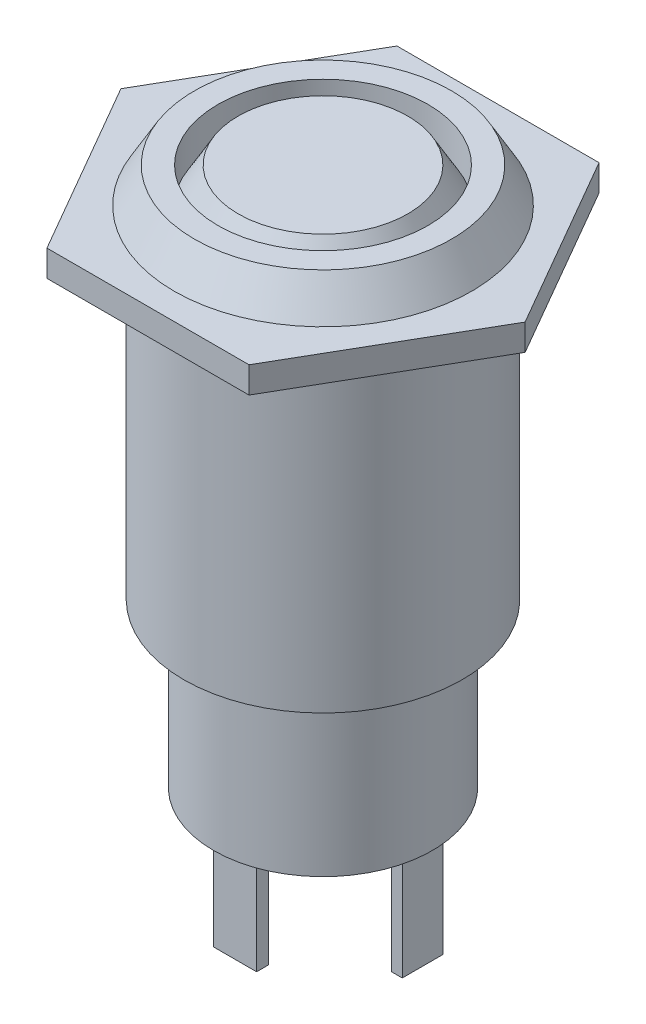
ISO-10303-21;
HEADER;
FILE_DESCRIPTION(('STEP AP214'),'2;1');
FILE_NAME('part.step','',(''),(''),'','','');
FILE_SCHEMA(('AUTOMOTIVE_DESIGN { 1 0 10303 214 1 1 1 1 }'));
ENDSEC;
DATA;
#1=APPLICATION_CONTEXT('core data for automotive mechanical design processes');
#2=APPLICATION_PROTOCOL_DEFINITION('international standard','automotive_design',2000,#1);
#3=PRODUCT_CONTEXT('',#1,'mechanical');
#4=PRODUCT('Part','Part','',(#3));
#5=PRODUCT_RELATED_PRODUCT_CATEGORY('part','',(#4));
#6=PRODUCT_DEFINITION_FORMATION('','',#4);
#7=PRODUCT_DEFINITION_CONTEXT('part definition',#1,'design');
#8=PRODUCT_DEFINITION('design','',#6,#7);
#9=PRODUCT_DEFINITION_SHAPE('','',#8);
#10=(LENGTH_UNIT() NAMED_UNIT(*) SI_UNIT(.MILLI.,.METRE.));
#11=(NAMED_UNIT(*) PLANE_ANGLE_UNIT() SI_UNIT($,.RADIAN.));
#12=(NAMED_UNIT(*) SI_UNIT($,.STERADIAN.) SOLID_ANGLE_UNIT());
#13=UNCERTAINTY_MEASURE_WITH_UNIT(LENGTH_MEASURE(1.E-05),#10,'distance_accuracy_value','');
#14=(GEOMETRIC_REPRESENTATION_CONTEXT(3) GLOBAL_UNCERTAINTY_ASSIGNED_CONTEXT((#13)) GLOBAL_UNIT_ASSIGNED_CONTEXT((#10,
#11,#12)) REPRESENTATION_CONTEXT('',''));
#15=CARTESIAN_POINT('',(0.,0.,0.));
#16=DIRECTION('',(0.,0.,1.));
#17=DIRECTION('',(1.,0.,0.));
#18=AXIS2_PLACEMENT_3D('',#15,#16,#17);
#19=CARTESIAN_POINT('',(0.,-9.3,0.));
#20=DIRECTION('',(0.,-1.,0.));
#21=DIRECTION('',(0.,0.,-1.));
#22=AXIS2_PLACEMENT_3D('',#19,#20,#21);
#23=PLANE('',#22);
#24=CARTESIAN_POINT('',(0.,-9.3,0.));
#25=DIRECTION('',(0.,-1.,0.));
#26=DIRECTION('',(0.,0.,-1.));
#27=AXIS2_PLACEMENT_3D('',#24,#25,#26);
#28=CIRCLE('',#27,6.25);
#29=CARTESIAN_POINT('',(0.,-9.3,-6.25));
#30=VERTEX_POINT('',#29);
#31=EDGE_CURVE('E299',#30,#30,#28,.T.);
#32=ORIENTED_EDGE('',*,*,#31,.T.);
#33=EDGE_LOOP('',(#32));
#34=FACE_BOUND('',#33,.T.);
#35=DIRECTION('',(-1.,0.,0.));
#36=VECTOR('',#35,1.);
#37=CARTESIAN_POINT('',(-1.22799585463233,-9.3,5.02200414536767));
#38=LINE('',#37,#36);
#39=CARTESIAN_POINT('',(1.22799585463233,-9.3,5.02200414536767));
#40=VERTEX_POINT('',#39);
#41=CARTESIAN_POINT('',(-1.22799585463233,-9.3,5.02200414536767));
#42=VERTEX_POINT('',#41);
#43=EDGE_CURVE('E284',#40,#42,#38,.T.);
#44=ORIENTED_EDGE('',*,*,#43,.F.);
#45=DIRECTION('',(0.,0.,1.));
#46=VECTOR('',#45,1.);
#47=CARTESIAN_POINT('',(1.22799585463233,-9.3,4.34589242177077));
#48=LINE('',#47,#46);
#49=CARTESIAN_POINT('',(1.22799585463233,-9.3,4.34589242177077));
#50=VERTEX_POINT('',#49);
#51=EDGE_CURVE('E270',#50,#40,#48,.T.);
#52=ORIENTED_EDGE('',*,*,#51,.F.);
#53=DIRECTION('',(1.,0.,0.));
#54=VECTOR('',#53,1.);
#55=CARTESIAN_POINT('',(-1.22799585463233,-9.3,4.34589242177077));
#56=LINE('',#55,#54);
#57=CARTESIAN_POINT('',(-1.22799585463233,-9.3,4.34589242177077));
#58=VERTEX_POINT('',#57);
#59=EDGE_CURVE('E275',#58,#50,#56,.T.);
#60=ORIENTED_EDGE('',*,*,#59,.F.);
#61=DIRECTION('',(0.,0.,-1.));
#62=VECTOR('',#61,1.);
#63=CARTESIAN_POINT('',(-1.22799585463233,-9.3,4.34589242177077));
#64=LINE('',#63,#62);
#65=EDGE_CURVE('E286',#42,#58,#64,.T.);
#66=ORIENTED_EDGE('',*,*,#65,.F.);
#67=EDGE_LOOP('',(#44,#52,#60,#66));
#68=FACE_BOUND('',#67,.T.);
#69=DIRECTION('',(1.,0.,0.));
#70=VECTOR('',#69,1.);
#71=CARTESIAN_POINT('',(5.69608046213855,-9.3,-1.16693552809612));
#72=LINE('',#71,#70);
#73=CARTESIAN_POINT('',(5.08306447190388,-9.3,-1.16693552809612));
#74=VERTEX_POINT('',#73);
#75=CARTESIAN_POINT('',(5.69608046213855,-9.3,-1.16693552809612));
#76=VERTEX_POINT('',#75);
#77=EDGE_CURVE('E255',#74,#76,#72,.T.);
#78=ORIENTED_EDGE('',*,*,#77,.F.);
#79=DIRECTION('',(0.,0.,-1.));
#80=VECTOR('',#79,1.);
#81=CARTESIAN_POINT('',(5.08306447190388,-9.3,1.16693552809612));
#82=LINE('',#81,#80);
#83=CARTESIAN_POINT('',(5.08306447190388,-9.3,1.16693552809612));
#84=VERTEX_POINT('',#83);
#85=EDGE_CURVE('E241',#84,#74,#82,.T.);
#86=ORIENTED_EDGE('',*,*,#85,.F.);
#87=DIRECTION('',(-1.,0.,0.));
#88=VECTOR('',#87,1.);
#89=CARTESIAN_POINT('',(5.69608046213855,-9.3,1.16693552809612));
#90=LINE('',#89,#88);
#91=CARTESIAN_POINT('',(5.69608046213855,-9.3,1.16693552809612));
#92=VERTEX_POINT('',#91);
#93=EDGE_CURVE('E246',#92,#84,#90,.T.);
#94=ORIENTED_EDGE('',*,*,#93,.F.);
#95=DIRECTION('',(0.,0.,1.));
#96=VECTOR('',#95,1.);
#97=CARTESIAN_POINT('',(5.69608046213855,-9.3,1.16693552809612));
#98=LINE('',#97,#96);
#99=EDGE_CURVE('E257',#76,#92,#98,.T.);
#100=ORIENTED_EDGE('',*,*,#99,.F.);
#101=EDGE_LOOP('',(#78,#86,#94,#100));
#102=FACE_BOUND('',#101,.T.);
#103=DIRECTION('',(-1.,0.,0.));
#104=VECTOR('',#103,1.);
#105=CARTESIAN_POINT('',(-1.22799585463233,-9.3,-4.57555512226407));
#106=LINE('',#105,#104);
#107=CARTESIAN_POINT('',(1.22799585463233,-9.3,-4.57555512226407));
#108=VERTEX_POINT('',#107);
#109=CARTESIAN_POINT('',(-1.22799585463233,-9.3,-4.57555512226407));
#110=VERTEX_POINT('',#109);
#111=EDGE_CURVE('E213',#108,#110,#106,.T.);
#112=ORIENTED_EDGE('',*,*,#111,.F.);
#113=DIRECTION('',(0.,0.,1.));
#114=VECTOR('',#113,1.);
#115=CARTESIAN_POINT('',(1.22799585463233,-9.3,-5.38989741021582));
#116=LINE('',#115,#114);
#117=CARTESIAN_POINT('',(1.22799585463233,-9.3,-5.38989741021582));
#118=VERTEX_POINT('',#117);
#119=EDGE_CURVE('E210',#118,#108,#116,.T.);
#120=ORIENTED_EDGE('',*,*,#119,.F.);
#121=DIRECTION('',(1.,0.,0.));
#122=VECTOR('',#121,1.);
#123=CARTESIAN_POINT('',(-1.22799585463233,-9.3,-5.38989741021582));
#124=LINE('',#123,#122);
#125=CARTESIAN_POINT('',(-1.22799585463233,-9.3,-5.38989741021582));
#126=VERTEX_POINT('',#125);
#127=EDGE_CURVE('E222',#126,#118,#124,.T.);
#128=ORIENTED_EDGE('',*,*,#127,.F.);
#129=DIRECTION('',(0.,0.,-1.));
#130=VECTOR('',#129,1.);
#131=CARTESIAN_POINT('',(-1.22799585463233,-9.3,-5.38989741021582));
#132=LINE('',#131,#130);
#133=EDGE_CURVE('E230',#110,#126,#132,.T.);
#134=ORIENTED_EDGE('',*,*,#133,.F.);
#135=EDGE_LOOP('',(#112,#120,#128,#134));
#136=FACE_BOUND('',#135,.T.);
#137=DIRECTION('',(-1.,0.,0.));
#138=VECTOR('',#137,1.);
#139=CARTESIAN_POINT('',(-5.0090997101677,-9.3,1.16693552809612));
#140=LINE('',#139,#138);
#141=CARTESIAN_POINT('',(-4.40627813467849,-9.3,1.16693552809612));
#142=VERTEX_POINT('',#141);
#143=CARTESIAN_POINT('',(-5.0090997101677,-9.3,1.16693552809612));
#144=VERTEX_POINT('',#143);
#145=EDGE_CURVE('E757',#142,#144,#140,.T.);
#146=ORIENTED_EDGE('',*,*,#145,.F.);
#147=DIRECTION('',(0.,0.,1.));
#148=VECTOR('',#147,1.);
#149=CARTESIAN_POINT('',(-4.40627813467849,-9.3,-1.16693552809612));
#150=LINE('',#149,#148);
#151=CARTESIAN_POINT('',(-4.40627813467849,-9.3,-1.16693552809612));
#152=VERTEX_POINT('',#151);
#153=EDGE_CURVE('E208',#152,#142,#150,.T.);
#154=ORIENTED_EDGE('',*,*,#153,.F.);
#155=DIRECTION('',(1.,0.,0.));
#156=VECTOR('',#155,1.);
#157=CARTESIAN_POINT('',(-5.0090997101677,-9.3,-1.16693552809612));
#158=LINE('',#157,#156);
#159=CARTESIAN_POINT('',(-5.0090997101677,-9.3,-1.16693552809612));
#160=VERTEX_POINT('',#159);
#161=EDGE_CURVE('E204',#160,#152,#158,.T.);
#162=ORIENTED_EDGE('',*,*,#161,.F.);
#163=DIRECTION('',(0.,0.,-1.));
#164=VECTOR('',#163,1.);
#165=CARTESIAN_POINT('',(-5.0090997101677,-9.3,-1.16693552809612));
#166=LINE('',#165,#164);
#167=EDGE_CURVE('E754',#144,#160,#166,.T.);
#168=ORIENTED_EDGE('',*,*,#167,.F.);
#169=EDGE_LOOP('',(#146,#154,#162,#168));
#170=FACE_BOUND('',#169,.T.);
#171=ADVANCED_FACE('F35',(#34,#68,#102,#136,#170),#23,.T.);
#172=CARTESIAN_POINT('',(0.,19.5,0.));
#173=DIRECTION('',(0.,-1.,0.));
#174=DIRECTION('',(0.,0.,-1.));
#175=AXIS2_PLACEMENT_3D('',#172,#173,#174);
#176=CYLINDRICAL_SURFACE('',#175,7.95);
#177=CARTESIAN_POINT('',(0.,0.,0.));
#178=DIRECTION('',(0.,1.,0.));
#179=DIRECTION('',(0.,0.,1.));
#180=AXIS2_PLACEMENT_3D('',#177,#178,#179);
#181=CIRCLE('',#180,7.95);
#182=CARTESIAN_POINT('',(0.,0.,7.95));
#183=VERTEX_POINT('',#182);
#184=EDGE_CURVE('E356',#183,#183,#181,.T.);
#185=ORIENTED_EDGE('',*,*,#184,.T.);
#186=EDGE_LOOP('',(#185));
#187=FACE_BOUND('',#186,.T.);
#188=CARTESIAN_POINT('',(0.,18.,0.));
#189=DIRECTION('',(0.,1.,0.));
#190=DIRECTION('',(0.,0.,1.));
#191=AXIS2_PLACEMENT_3D('',#188,#189,#190);
#192=CIRCLE('',#191,7.95);
#193=CARTESIAN_POINT('',(0.,18.,7.95));
#194=VERTEX_POINT('',#193);
#195=EDGE_CURVE('E43',#194,#194,#192,.T.);
#196=ORIENTED_EDGE('',*,*,#195,.F.);
#197=EDGE_LOOP('',(#196));
#198=FACE_BOUND('',#197,.T.);
#199=ADVANCED_FACE('F37',(#187,#198),#176,.T.);
#200=CARTESIAN_POINT('',(0.,0.,0.));
#201=DIRECTION('',(0.,1.,0.));
#202=DIRECTION('',(0.,0.,1.));
#203=AXIS2_PLACEMENT_3D('',#200,#201,#202);
#204=PLANE('',#203);
#205=CARTESIAN_POINT('',(0.,0.,0.));
#206=DIRECTION('',(0.,1.,0.));
#207=DIRECTION('',(0.,0.,1.));
#208=AXIS2_PLACEMENT_3D('',#205,#206,#207);
#209=CIRCLE('',#208,6.25);
#210=CARTESIAN_POINT('',(0.,0.,6.25));
#211=VERTEX_POINT('',#210);
#212=EDGE_CURVE('E11',#211,#211,#209,.F.);
#213=ORIENTED_EDGE('',*,*,#212,.F.);
#214=EDGE_LOOP('',(#213));
#215=FACE_BOUND('',#214,.T.);
#216=ORIENTED_EDGE('',*,*,#184,.F.);
#217=EDGE_LOOP('',(#216));
#218=FACE_BOUND('',#217,.T.);
#219=ADVANCED_FACE('F374',(#215,#218),#204,.F.);
#220=CARTESIAN_POINT('',(5.77350269189626,18.,10.));
#221=DIRECTION('',(0.866025403784439,0.,0.5));
#222=DIRECTION('',(0.5,0.,-0.866025403784439));
#223=AXIS2_PLACEMENT_3D('',#220,#221,#222);
#224=PLANE('',#223);
#225=DIRECTION('',(0.5,0.,-0.866025403784439));
#226=VECTOR('',#225,1.);
#227=CARTESIAN_POINT('',(5.77350269189626,19.5,10.));
#228=LINE('',#227,#226);
#229=CARTESIAN_POINT('',(5.77350269189626,19.5,10.));
#230=VERTEX_POINT('',#229);
#231=CARTESIAN_POINT('',(11.5470053837925,19.5,0.));
#232=VERTEX_POINT('',#231);
#233=EDGE_CURVE('E317',#230,#232,#228,.T.);
#234=ORIENTED_EDGE('',*,*,#233,.F.);
#235=DIRECTION('',(0.,1.,0.));
#236=VECTOR('',#235,1.);
#237=CARTESIAN_POINT('',(5.77350269189626,18.,10.));
#238=LINE('',#237,#236);
#239=CARTESIAN_POINT('',(5.77350269189626,18.,10.));
#240=VERTEX_POINT('',#239);
#241=EDGE_CURVE('E354',#240,#230,#238,.T.);
#242=ORIENTED_EDGE('',*,*,#241,.F.);
#243=DIRECTION('',(0.5,0.,-0.866025403784439));
#244=VECTOR('',#243,1.);
#245=CARTESIAN_POINT('',(5.77350269189626,18.,10.));
#246=LINE('',#245,#244);
#247=CARTESIAN_POINT('',(11.5470053837925,18.,0.));
#248=VERTEX_POINT('',#247);
#249=EDGE_CURVE('E318',#240,#248,#246,.T.);
#250=ORIENTED_EDGE('',*,*,#249,.T.);
#251=DIRECTION('',(0.,1.,0.));
#252=VECTOR('',#251,1.);
#253=CARTESIAN_POINT('',(11.5470053837925,18.,0.));
#254=LINE('',#253,#252);
#255=EDGE_CURVE('E337',#248,#232,#254,.T.);
#256=ORIENTED_EDGE('',*,*,#255,.T.);
#257=EDGE_LOOP('',(#234,#242,#250,#256));
#258=FACE_BOUND('',#257,.T.);
#259=ADVANCED_FACE('F380',(#258),#224,.T.);
#260=CARTESIAN_POINT('',(-5.77350269189626,18.,10.));
#261=DIRECTION('',(0.,0.,1.));
#262=DIRECTION('',(1.,0.,0.));
#263=AXIS2_PLACEMENT_3D('',#260,#261,#262);
#264=PLANE('',#263);
#265=DIRECTION('',(1.,0.,0.));
#266=VECTOR('',#265,1.);
#267=CARTESIAN_POINT('',(-5.77350269189626,19.5,10.));
#268=LINE('',#267,#266);
#269=CARTESIAN_POINT('',(-5.77350269189626,19.5,10.));
#270=VERTEX_POINT('',#269);
#271=EDGE_CURVE('E322',#270,#230,#268,.T.);
#272=ORIENTED_EDGE('',*,*,#271,.F.);
#273=DIRECTION('',(0.,1.,0.));
#274=VECTOR('',#273,1.);
#275=CARTESIAN_POINT('',(-5.77350269189626,18.,10.));
#276=LINE('',#275,#274);
#277=CARTESIAN_POINT('',(-5.77350269189626,18.,10.));
#278=VERTEX_POINT('',#277);
#279=EDGE_CURVE('E357',#278,#270,#276,.T.);
#280=ORIENTED_EDGE('',*,*,#279,.F.);
#281=DIRECTION('',(1.,0.,0.));
#282=VECTOR('',#281,1.);
#283=CARTESIAN_POINT('',(-5.77350269189626,18.,10.));
#284=LINE('',#283,#282);
#285=EDGE_CURVE('E334',#278,#240,#284,.T.);
#286=ORIENTED_EDGE('',*,*,#285,.T.);
#287=ORIENTED_EDGE('',*,*,#241,.T.);
#288=EDGE_LOOP('',(#272,#280,#286,#287));
#289=FACE_BOUND('',#288,.T.);
#290=ADVANCED_FACE('F421',(#289),#264,.T.);
#291=CARTESIAN_POINT('',(-11.5470053837925,18.,0.));
#292=DIRECTION('',(-0.866025403784438,0.,0.5));
#293=DIRECTION('',(0.5,0.,0.866025403784439));
#294=AXIS2_PLACEMENT_3D('',#291,#292,#293);
#295=PLANE('',#294);
#296=DIRECTION('',(0.5,0.,0.866025403784439));
#297=VECTOR('',#296,1.);
#298=CARTESIAN_POINT('',(-11.5470053837925,19.5,0.));
#299=LINE('',#298,#297);
#300=CARTESIAN_POINT('',(-11.5470053837925,19.5,0.));
#301=VERTEX_POINT('',#300);
#302=EDGE_CURVE('E349',#301,#270,#299,.T.);
#303=ORIENTED_EDGE('',*,*,#302,.F.);
#304=DIRECTION('',(0.,1.,0.));
#305=VECTOR('',#304,1.);
#306=CARTESIAN_POINT('',(-11.5470053837925,18.,0.));
#307=LINE('',#306,#305);
#308=CARTESIAN_POINT('',(-11.5470053837925,18.,0.));
#309=VERTEX_POINT('',#308);
#310=EDGE_CURVE('E359',#309,#301,#307,.T.);
#311=ORIENTED_EDGE('',*,*,#310,.F.);
#312=DIRECTION('',(0.5,0.,0.866025403784439));
#313=VECTOR('',#312,1.);
#314=CARTESIAN_POINT('',(-11.5470053837925,18.,0.));
#315=LINE('',#314,#313);
#316=EDGE_CURVE('E331',#309,#278,#315,.T.);
#317=ORIENTED_EDGE('',*,*,#316,.T.);
#318=ORIENTED_EDGE('',*,*,#279,.T.);
#319=EDGE_LOOP('',(#303,#311,#317,#318));
#320=FACE_BOUND('',#319,.T.);
#321=ADVANCED_FACE('F424',(#320),#295,.T.);
#322=CARTESIAN_POINT('',(-5.77350269189626,18.,-10.));
#323=DIRECTION('',(-0.866025403784439,0.,-0.5));
#324=DIRECTION('',(-0.5,0.,0.866025403784439));
#325=AXIS2_PLACEMENT_3D('',#322,#323,#324);
#326=PLANE('',#325);
#327=DIRECTION('',(-0.5,0.,0.866025403784439));
#328=VECTOR('',#327,1.);
#329=CARTESIAN_POINT('',(-5.77350269189626,19.5,-10.));
#330=LINE('',#329,#328);
#331=CARTESIAN_POINT('',(-5.77350269189626,19.5,-10.));
#332=VERTEX_POINT('',#331);
#333=EDGE_CURVE('E346',#332,#301,#330,.T.);
#334=ORIENTED_EDGE('',*,*,#333,.F.);
#335=DIRECTION('',(0.,1.,0.));
#336=VECTOR('',#335,1.);
#337=CARTESIAN_POINT('',(-5.77350269189626,18.,-10.));
#338=LINE('',#337,#336);
#339=CARTESIAN_POINT('',(-5.77350269189626,18.,-10.));
#340=VERTEX_POINT('',#339);
#341=EDGE_CURVE('E361',#340,#332,#338,.T.);
#342=ORIENTED_EDGE('',*,*,#341,.F.);
#343=DIRECTION('',(-0.5,0.,0.866025403784439));
#344=VECTOR('',#343,1.);
#345=CARTESIAN_POINT('',(-5.77350269189626,18.,-10.));
#346=LINE('',#345,#344);
#347=EDGE_CURVE('E328',#340,#309,#346,.T.);
#348=ORIENTED_EDGE('',*,*,#347,.T.);
#349=ORIENTED_EDGE('',*,*,#310,.T.);
#350=EDGE_LOOP('',(#334,#342,#348,#349));
#351=FACE_BOUND('',#350,.T.);
#352=ADVANCED_FACE('F428',(#351),#326,.T.);
#353=CARTESIAN_POINT('',(5.77350269189625,18.,-10.));
#354=DIRECTION('',(0.,0.,-1.));
#355=DIRECTION('',(-1.,0.,0.));
#356=AXIS2_PLACEMENT_3D('',#353,#354,#355);
#357=PLANE('',#356);
#358=DIRECTION('',(-1.,0.,0.));
#359=VECTOR('',#358,1.);
#360=CARTESIAN_POINT('',(5.77350269189625,19.5,-10.));
#361=LINE('',#360,#359);
#362=CARTESIAN_POINT('',(5.77350269189625,19.5,-10.));
#363=VERTEX_POINT('',#362);
#364=EDGE_CURVE('E343',#363,#332,#361,.T.);
#365=ORIENTED_EDGE('',*,*,#364,.F.);
#366=DIRECTION('',(0.,1.,0.));
#367=VECTOR('',#366,1.);
#368=CARTESIAN_POINT('',(5.77350269189625,18.,-10.));
#369=LINE('',#368,#367);
#370=CARTESIAN_POINT('',(5.77350269189625,18.,-10.));
#371=VERTEX_POINT('',#370);
#372=EDGE_CURVE('E363',#371,#363,#369,.T.);
#373=ORIENTED_EDGE('',*,*,#372,.F.);
#374=DIRECTION('',(-1.,0.,0.));
#375=VECTOR('',#374,1.);
#376=CARTESIAN_POINT('',(5.77350269189625,18.,-10.));
#377=LINE('',#376,#375);
#378=EDGE_CURVE('E325',#371,#340,#377,.T.);
#379=ORIENTED_EDGE('',*,*,#378,.T.);
#380=ORIENTED_EDGE('',*,*,#341,.T.);
#381=EDGE_LOOP('',(#365,#373,#379,#380));
#382=FACE_BOUND('',#381,.T.);
#383=ADVANCED_FACE('F432',(#382),#357,.T.);
#384=CARTESIAN_POINT('',(11.5470053837925,18.,0.));
#385=DIRECTION('',(0.866025403784439,0.,-0.5));
#386=DIRECTION('',(-0.5,0.,-0.866025403784439));
#387=AXIS2_PLACEMENT_3D('',#384,#385,#386);
#388=PLANE('',#387);
#389=DIRECTION('',(-0.5,0.,-0.866025403784439));
#390=VECTOR('',#389,1.);
#391=CARTESIAN_POINT('',(11.5470053837925,19.5,0.));
#392=LINE('',#391,#390);
#393=EDGE_CURVE('E340',#232,#363,#392,.T.);
#394=ORIENTED_EDGE('',*,*,#393,.F.);
#395=ORIENTED_EDGE('',*,*,#255,.F.);
#396=DIRECTION('',(-0.5,0.,-0.866025403784439));
#397=VECTOR('',#396,1.);
#398=CARTESIAN_POINT('',(11.5470053837925,18.,0.));
#399=LINE('',#398,#397);
#400=EDGE_CURVE('E321',#248,#371,#399,.T.);
#401=ORIENTED_EDGE('',*,*,#400,.T.);
#402=ORIENTED_EDGE('',*,*,#372,.T.);
#403=EDGE_LOOP('',(#394,#395,#401,#402));
#404=FACE_BOUND('',#403,.T.);
#405=ADVANCED_FACE('F420',(#404),#388,.T.);
#406=CARTESIAN_POINT('',(0.,18.,0.));
#407=DIRECTION('',(0.,1.,0.));
#408=DIRECTION('',(0.,0.,1.));
#409=AXIS2_PLACEMENT_3D('',#406,#407,#408);
#410=PLANE('',#409);
#411=ORIENTED_EDGE('',*,*,#195,.T.);
#412=EDGE_LOOP('',(#411));
#413=FACE_BOUND('',#412,.T.);
#414=ORIENTED_EDGE('',*,*,#249,.F.);
#415=ORIENTED_EDGE('',*,*,#285,.F.);
#416=ORIENTED_EDGE('',*,*,#316,.F.);
#417=ORIENTED_EDGE('',*,*,#347,.F.);
#418=ORIENTED_EDGE('',*,*,#378,.F.);
#419=ORIENTED_EDGE('',*,*,#400,.F.);
#420=EDGE_LOOP('',(#414,#415,#416,#417,#418,#419));
#421=FACE_BOUND('',#420,.T.);
#422=ADVANCED_FACE('F370',(#413,#421),#410,.F.);
#423=CARTESIAN_POINT('',(0.,19.5,0.));
#424=DIRECTION('',(0.,1.,0.));
#425=DIRECTION('',(0.,0.,1.));
#426=AXIS2_PLACEMENT_3D('',#423,#424,#425);
#427=PLANE('',#426);
#428=CARTESIAN_POINT('',(0.,19.5,0.));
#429=DIRECTION('',(0.,1.,0.));
#430=DIRECTION('',(0.,0.,1.));
#431=AXIS2_PLACEMENT_3D('',#428,#429,#430);
#432=CIRCLE('',#431,8.5);
#433=CARTESIAN_POINT('',(0.,19.5,8.5));
#434=VERTEX_POINT('',#433);
#435=EDGE_CURVE('E309',#434,#434,#432,.T.);
#436=ORIENTED_EDGE('',*,*,#435,.F.);
#437=EDGE_LOOP('',(#436));
#438=FACE_BOUND('',#437,.T.);
#439=ORIENTED_EDGE('',*,*,#233,.T.);
#440=ORIENTED_EDGE('',*,*,#393,.T.);
#441=ORIENTED_EDGE('',*,*,#364,.T.);
#442=ORIENTED_EDGE('',*,*,#333,.T.);
#443=ORIENTED_EDGE('',*,*,#302,.T.);
#444=ORIENTED_EDGE('',*,*,#271,.T.);
#445=EDGE_LOOP('',(#439,#440,#441,#442,#443,#444));
#446=FACE_BOUND('',#445,.T.);
#447=ADVANCED_FACE('F416',(#438,#446),#427,.T.);
#448=CARTESIAN_POINT('',(0.,19.5,0.));
#449=DIRECTION('',(0.,-1.,0.));
#450=DIRECTION('',(0.,0.,1.));
#451=AXIS2_PLACEMENT_3D('',#448,#449,#450);
#452=CONICAL_SURFACE('',#451,8.5,0.5235987755983);
#453=CARTESIAN_POINT('',(0.,21.5,0.));
#454=DIRECTION('',(0.,1.,0.));
#455=DIRECTION('',(0.,0.,1.));
#456=AXIS2_PLACEMENT_3D('',#453,#454,#455);
#457=CIRCLE('',#456,7.34529946162075);
#458=CARTESIAN_POINT('',(0.,21.5,7.34529946162075));
#459=VERTEX_POINT('',#458);
#460=EDGE_CURVE('E314',#459,#459,#457,.T.);
#461=ORIENTED_EDGE('',*,*,#460,.F.);
#462=EDGE_LOOP('',(#461));
#463=FACE_BOUND('',#462,.T.);
#464=ORIENTED_EDGE('',*,*,#435,.T.);
#465=EDGE_LOOP('',(#464));
#466=FACE_BOUND('',#465,.T.);
#467=ADVANCED_FACE('F412',(#463,#466),#452,.T.);
#468=CARTESIAN_POINT('',(0.,21.5,0.));
#469=DIRECTION('',(0.,1.,0.));
#470=DIRECTION('',(0.,0.,1.));
#471=AXIS2_PLACEMENT_3D('',#468,#469,#470);
#472=PLANE('',#471);
#473=CARTESIAN_POINT('',(0.,21.5,0.));
#474=DIRECTION('',(0.,1.,0.));
#475=DIRECTION('',(0.,0.,1.));
#476=AXIS2_PLACEMENT_3D('',#473,#474,#475);
#477=CIRCLE('',#476,6.);
#478=CARTESIAN_POINT('',(0.,21.5,6.));
#479=VERTEX_POINT('',#478);
#480=EDGE_CURVE('E305',#479,#479,#477,.T.);
#481=ORIENTED_EDGE('',*,*,#480,.F.);
#482=EDGE_LOOP('',(#481));
#483=FACE_BOUND('',#482,.T.);
#484=ORIENTED_EDGE('',*,*,#460,.T.);
#485=EDGE_LOOP('',(#484));
#486=FACE_BOUND('',#485,.T.);
#487=ADVANCED_FACE('F408',(#483,#486),#472,.T.);
#488=CARTESIAN_POINT('',(0.,19.5,0.));
#489=DIRECTION('',(0.,1.,0.));
#490=DIRECTION('',(0.,0.,1.));
#491=AXIS2_PLACEMENT_3D('',#488,#489,#490);
#492=CYLINDRICAL_SURFACE('',#491,6.);
#493=CARTESIAN_POINT('',(0.,19.5,0.));
#494=DIRECTION('',(0.,1.,0.));
#495=DIRECTION('',(0.,0.,1.));
#496=AXIS2_PLACEMENT_3D('',#493,#494,#495);
#497=CIRCLE('',#496,6.);
#498=CARTESIAN_POINT('',(0.,19.5,6.));
#499=VERTEX_POINT('',#498);
#500=EDGE_CURVE('E306',#499,#499,#497,.T.);
#501=ORIENTED_EDGE('',*,*,#500,.F.);
#502=EDGE_LOOP('',(#501));
#503=FACE_BOUND('',#502,.T.);
#504=ORIENTED_EDGE('',*,*,#480,.T.);
#505=EDGE_LOOP('',(#504));
#506=FACE_BOUND('',#505,.T.);
#507=ADVANCED_FACE('F404',(#503,#506),#492,.F.);
#508=CARTESIAN_POINT('',(0.,19.5,0.));
#509=DIRECTION('',(0.,-1.,0.));
#510=DIRECTION('',(0.,0.,1.));
#511=AXIS2_PLACEMENT_3D('',#508,#509,#510);
#512=CONICAL_SURFACE('',#511,6.,0.5235987755983);
#513=CARTESIAN_POINT('',(0.,21.5,0.));
#514=DIRECTION('',(0.,1.,0.));
#515=DIRECTION('',(0.,0.,1.));
#516=AXIS2_PLACEMENT_3D('',#513,#514,#515);
#517=CIRCLE('',#516,4.84529946162074);
#518=CARTESIAN_POINT('',(0.,21.5,4.84529946162074));
#519=VERTEX_POINT('',#518);
#520=EDGE_CURVE('E302',#519,#519,#517,.T.);
#521=ORIENTED_EDGE('',*,*,#520,.F.);
#522=EDGE_LOOP('',(#521));
#523=FACE_BOUND('',#522,.T.);
#524=ORIENTED_EDGE('',*,*,#500,.T.);
#525=EDGE_LOOP('',(#524));
#526=FACE_BOUND('',#525,.T.);
#527=ADVANCED_FACE('F400',(#523,#526),#512,.T.);
#528=CARTESIAN_POINT('',(0.,21.5,0.));
#529=DIRECTION('',(0.,1.,0.));
#530=DIRECTION('',(0.,0.,1.));
#531=AXIS2_PLACEMENT_3D('',#528,#529,#530);
#532=PLANE('',#531);
#533=ORIENTED_EDGE('',*,*,#520,.T.);
#534=EDGE_LOOP('',(#533));
#535=FACE_BOUND('',#534,.T.);
#536=ADVANCED_FACE('F396',(#535),#532,.T.);
#537=CARTESIAN_POINT('',(0.,-9.3,0.));
#538=DIRECTION('',(0.,1.,0.));
#539=DIRECTION('',(0.,0.,1.));
#540=AXIS2_PLACEMENT_3D('',#537,#538,#539);
#541=CYLINDRICAL_SURFACE('',#540,6.25);
#542=ORIENTED_EDGE('',*,*,#31,.F.);
#543=EDGE_LOOP('',(#542));
#544=FACE_BOUND('',#543,.T.);
#545=ORIENTED_EDGE('',*,*,#212,.T.);
#546=EDGE_LOOP('',(#545));
#547=FACE_BOUND('',#546,.T.);
#548=ADVANCED_FACE('F393',(#544,#547),#541,.T.);
#549=CARTESIAN_POINT('',(1.22799585463233,-15.3,4.34589242177077));
#550=DIRECTION('',(-1.,0.,0.));
#551=DIRECTION('',(0.,0.,1.));
#552=AXIS2_PLACEMENT_3D('',#549,#550,#551);
#553=PLANE('',#552);
#554=ORIENTED_EDGE('',*,*,#51,.T.);
#555=DIRECTION('',(0.,1.,0.));
#556=VECTOR('',#555,1.);
#557=CARTESIAN_POINT('',(1.22799585463233,-15.3,5.02200414536767));
#558=LINE('',#557,#556);
#559=CARTESIAN_POINT('',(1.22799585463233,-15.3,5.02200414536767));
#560=VERTEX_POINT('',#559);
#561=EDGE_CURVE('E297',#560,#40,#558,.T.);
#562=ORIENTED_EDGE('',*,*,#561,.F.);
#563=DIRECTION('',(0.,0.,1.));
#564=VECTOR('',#563,1.);
#565=CARTESIAN_POINT('',(1.22799585463233,-15.3,4.34589242177077));
#566=LINE('',#565,#564);
#567=CARTESIAN_POINT('',(1.22799585463233,-15.3,4.34589242177077));
#568=VERTEX_POINT('',#567);
#569=EDGE_CURVE('E271',#568,#560,#566,.T.);
#570=ORIENTED_EDGE('',*,*,#569,.F.);
#571=DIRECTION('',(0.,1.,0.));
#572=VECTOR('',#571,1.);
#573=CARTESIAN_POINT('',(1.22799585463233,-15.3,4.34589242177077));
#574=LINE('',#573,#572);
#575=EDGE_CURVE('E281',#568,#50,#574,.T.);
#576=ORIENTED_EDGE('',*,*,#575,.T.);
#577=EDGE_LOOP('',(#554,#562,#570,#576));
#578=FACE_BOUND('',#577,.T.);
#579=ADVANCED_FACE('F391',(#578),#553,.F.);
#580=CARTESIAN_POINT('',(-1.22799585463233,-15.3,5.02200414536767));
#581=DIRECTION('',(0.,0.,-1.));
#582=DIRECTION('',(-1.,0.,0.));
#583=AXIS2_PLACEMENT_3D('',#580,#581,#582);
#584=PLANE('',#583);
#585=ORIENTED_EDGE('',*,*,#43,.T.);
#586=DIRECTION('',(0.,1.,0.));
#587=VECTOR('',#586,1.);
#588=CARTESIAN_POINT('',(-1.22799585463233,-15.3,5.02200414536767));
#589=LINE('',#588,#587);
#590=CARTESIAN_POINT('',(-1.22799585463233,-15.3,5.02200414536767));
#591=VERTEX_POINT('',#590);
#592=EDGE_CURVE('E294',#591,#42,#589,.T.);
#593=ORIENTED_EDGE('',*,*,#592,.F.);
#594=DIRECTION('',(-1.,0.,0.));
#595=VECTOR('',#594,1.);
#596=CARTESIAN_POINT('',(-1.22799585463233,-15.3,5.02200414536767));
#597=LINE('',#596,#595);
#598=EDGE_CURVE('E274',#560,#591,#597,.T.);
#599=ORIENTED_EDGE('',*,*,#598,.F.);
#600=ORIENTED_EDGE('',*,*,#561,.T.);
#601=EDGE_LOOP('',(#585,#593,#599,#600));
#602=FACE_BOUND('',#601,.T.);
#603=ADVANCED_FACE('F495',(#602),#584,.F.);
#604=CARTESIAN_POINT('',(-1.22799585463233,-15.3,4.34589242177077));
#605=DIRECTION('',(1.,0.,0.));
#606=DIRECTION('',(0.,0.,-1.));
#607=AXIS2_PLACEMENT_3D('',#604,#605,#606);
#608=PLANE('',#607);
#609=ORIENTED_EDGE('',*,*,#65,.T.);
#610=DIRECTION('',(0.,1.,0.));
#611=VECTOR('',#610,1.);
#612=CARTESIAN_POINT('',(-1.22799585463233,-15.3,4.34589242177077));
#613=LINE('',#612,#611);
#614=CARTESIAN_POINT('',(-1.22799585463233,-15.3,4.34589242177077));
#615=VERTEX_POINT('',#614);
#616=EDGE_CURVE('E292',#615,#58,#613,.T.);
#617=ORIENTED_EDGE('',*,*,#616,.F.);
#618=DIRECTION('',(0.,0.,-1.));
#619=VECTOR('',#618,1.);
#620=CARTESIAN_POINT('',(-1.22799585463233,-15.3,4.34589242177077));
#621=LINE('',#620,#619);
#622=EDGE_CURVE('E277',#591,#615,#621,.T.);
#623=ORIENTED_EDGE('',*,*,#622,.F.);
#624=ORIENTED_EDGE('',*,*,#592,.T.);
#625=EDGE_LOOP('',(#609,#617,#623,#624));
#626=FACE_BOUND('',#625,.T.);
#627=ADVANCED_FACE('F502',(#626),#608,.F.);
#628=CARTESIAN_POINT('',(-1.22799585463233,-15.3,4.34589242177077));
#629=DIRECTION('',(0.,0.,1.));
#630=DIRECTION('',(1.,0.,0.));
#631=AXIS2_PLACEMENT_3D('',#628,#629,#630);
#632=PLANE('',#631);
#633=ORIENTED_EDGE('',*,*,#59,.T.);
#634=ORIENTED_EDGE('',*,*,#575,.F.);
#635=DIRECTION('',(1.,0.,0.));
#636=VECTOR('',#635,1.);
#637=CARTESIAN_POINT('',(-1.22799585463233,-15.3,4.34589242177077));
#638=LINE('',#637,#636);
#639=EDGE_CURVE('E279',#615,#568,#638,.T.);
#640=ORIENTED_EDGE('',*,*,#639,.F.);
#641=ORIENTED_EDGE('',*,*,#616,.T.);
#642=EDGE_LOOP('',(#633,#634,#640,#641));
#643=FACE_BOUND('',#642,.T.);
#644=ADVANCED_FACE('F509',(#643),#632,.F.);
#645=CARTESIAN_POINT('',(0.,-15.3,0.));
#646=DIRECTION('',(0.,1.,0.));
#647=DIRECTION('',(0.,0.,1.));
#648=AXIS2_PLACEMENT_3D('',#645,#646,#647);
#649=PLANE('',#648);
#650=ORIENTED_EDGE('',*,*,#569,.T.);
#651=ORIENTED_EDGE('',*,*,#598,.T.);
#652=ORIENTED_EDGE('',*,*,#622,.T.);
#653=ORIENTED_EDGE('',*,*,#639,.T.);
#654=EDGE_LOOP('',(#650,#651,#652,#653));
#655=FACE_BOUND('',#654,.T.);
#656=ADVANCED_FACE('F517',(#655),#649,.F.);
#657=CARTESIAN_POINT('',(5.08306447190388,-15.3,1.16693552809612));
#658=DIRECTION('',(1.,0.,0.));
#659=DIRECTION('',(0.,0.,-1.));
#660=AXIS2_PLACEMENT_3D('',#657,#658,#659);
#661=PLANE('',#660);
#662=ORIENTED_EDGE('',*,*,#85,.T.);
#663=DIRECTION('',(0.,1.,0.));
#664=VECTOR('',#663,1.);
#665=CARTESIAN_POINT('',(5.08306447190388,-15.3,-1.16693552809612));
#666=LINE('',#665,#664);
#667=CARTESIAN_POINT('',(5.08306447190388,-15.3,-1.16693552809612));
#668=VERTEX_POINT('',#667);
#669=EDGE_CURVE('E268',#668,#74,#666,.T.);
#670=ORIENTED_EDGE('',*,*,#669,.F.);
#671=DIRECTION('',(0.,0.,-1.));
#672=VECTOR('',#671,1.);
#673=CARTESIAN_POINT('',(5.08306447190388,-15.3,1.16693552809612));
#674=LINE('',#673,#672);
#675=CARTESIAN_POINT('',(5.08306447190388,-15.3,1.16693552809612));
#676=VERTEX_POINT('',#675);
#677=EDGE_CURVE('E242',#676,#668,#674,.T.);
#678=ORIENTED_EDGE('',*,*,#677,.F.);
#679=DIRECTION('',(0.,1.,0.));
#680=VECTOR('',#679,1.);
#681=CARTESIAN_POINT('',(5.08306447190388,-15.3,1.16693552809612));
#682=LINE('',#681,#680);
#683=EDGE_CURVE('E252',#676,#84,#682,.T.);
#684=ORIENTED_EDGE('',*,*,#683,.T.);
#685=EDGE_LOOP('',(#662,#670,#678,#684));
#686=FACE_BOUND('',#685,.T.);
#687=ADVANCED_FACE('F525',(#686),#661,.F.);
#688=CARTESIAN_POINT('',(5.69608046213855,-15.3,-1.16693552809612));
#689=DIRECTION('',(0.,0.,1.));
#690=DIRECTION('',(1.,0.,0.));
#691=AXIS2_PLACEMENT_3D('',#688,#689,#690);
#692=PLANE('',#691);
#693=ORIENTED_EDGE('',*,*,#77,.T.);
#694=DIRECTION('',(0.,1.,0.));
#695=VECTOR('',#694,1.);
#696=CARTESIAN_POINT('',(5.69608046213855,-15.3,-1.16693552809612));
#697=LINE('',#696,#695);
#698=CARTESIAN_POINT('',(5.69608046213855,-15.3,-1.16693552809612));
#699=VERTEX_POINT('',#698);
#700=EDGE_CURVE('E265',#699,#76,#697,.T.);
#701=ORIENTED_EDGE('',*,*,#700,.F.);
#702=DIRECTION('',(1.,0.,0.));
#703=VECTOR('',#702,1.);
#704=CARTESIAN_POINT('',(5.69608046213855,-15.3,-1.16693552809612));
#705=LINE('',#704,#703);
#706=EDGE_CURVE('E245',#668,#699,#705,.T.);
#707=ORIENTED_EDGE('',*,*,#706,.F.);
#708=ORIENTED_EDGE('',*,*,#669,.T.);
#709=EDGE_LOOP('',(#693,#701,#707,#708));
#710=FACE_BOUND('',#709,.T.);
#711=ADVANCED_FACE('F533',(#710),#692,.F.);
#712=CARTESIAN_POINT('',(5.69608046213855,-15.3,1.16693552809612));
#713=DIRECTION('',(-1.,0.,0.));
#714=DIRECTION('',(0.,0.,1.));
#715=AXIS2_PLACEMENT_3D('',#712,#713,#714);
#716=PLANE('',#715);
#717=ORIENTED_EDGE('',*,*,#99,.T.);
#718=DIRECTION('',(0.,1.,0.));
#719=VECTOR('',#718,1.);
#720=CARTESIAN_POINT('',(5.69608046213855,-15.3,1.16693552809612));
#721=LINE('',#720,#719);
#722=CARTESIAN_POINT('',(5.69608046213855,-15.3,1.16693552809612));
#723=VERTEX_POINT('',#722);
#724=EDGE_CURVE('E263',#723,#92,#721,.T.);
#725=ORIENTED_EDGE('',*,*,#724,.F.);
#726=DIRECTION('',(0.,0.,1.));
#727=VECTOR('',#726,1.);
#728=CARTESIAN_POINT('',(5.69608046213855,-15.3,1.16693552809612));
#729=LINE('',#728,#727);
#730=EDGE_CURVE('E248',#699,#723,#729,.T.);
#731=ORIENTED_EDGE('',*,*,#730,.F.);
#732=ORIENTED_EDGE('',*,*,#700,.T.);
#733=EDGE_LOOP('',(#717,#725,#731,#732));
#734=FACE_BOUND('',#733,.T.);
#735=ADVANCED_FACE('F541',(#734),#716,.F.);
#736=CARTESIAN_POINT('',(5.69608046213855,-15.3,1.16693552809612));
#737=DIRECTION('',(0.,0.,-1.));
#738=DIRECTION('',(-1.,0.,0.));
#739=AXIS2_PLACEMENT_3D('',#736,#737,#738);
#740=PLANE('',#739);
#741=ORIENTED_EDGE('',*,*,#93,.T.);
#742=ORIENTED_EDGE('',*,*,#683,.F.);
#743=DIRECTION('',(-1.,0.,0.));
#744=VECTOR('',#743,1.);
#745=CARTESIAN_POINT('',(5.69608046213855,-15.3,1.16693552809612));
#746=LINE('',#745,#744);
#747=EDGE_CURVE('E250',#723,#676,#746,.T.);
#748=ORIENTED_EDGE('',*,*,#747,.F.);
#749=ORIENTED_EDGE('',*,*,#724,.T.);
#750=EDGE_LOOP('',(#741,#742,#748,#749));
#751=FACE_BOUND('',#750,.T.);
#752=ADVANCED_FACE('F549',(#751),#740,.F.);
#753=CARTESIAN_POINT('',(0.,-15.3,0.));
#754=DIRECTION('',(0.,1.,0.));
#755=DIRECTION('',(0.,0.,1.));
#756=AXIS2_PLACEMENT_3D('',#753,#754,#755);
#757=PLANE('',#756);
#758=ORIENTED_EDGE('',*,*,#677,.T.);
#759=ORIENTED_EDGE('',*,*,#706,.T.);
#760=ORIENTED_EDGE('',*,*,#730,.T.);
#761=ORIENTED_EDGE('',*,*,#747,.T.);
#762=EDGE_LOOP('',(#758,#759,#760,#761));
#763=FACE_BOUND('',#762,.T.);
#764=ADVANCED_FACE('F557',(#763),#757,.F.);
#765=CARTESIAN_POINT('',(1.22799585463233,-15.3,-5.38989741021582));
#766=DIRECTION('',(-1.,0.,0.));
#767=DIRECTION('',(0.,0.,1.));
#768=AXIS2_PLACEMENT_3D('',#765,#766,#767);
#769=PLANE('',#768);
#770=ORIENTED_EDGE('',*,*,#119,.T.);
#771=DIRECTION('',(0.,1.,0.));
#772=VECTOR('',#771,1.);
#773=CARTESIAN_POINT('',(1.22799585463233,-15.3,-4.57555512226407));
#774=LINE('',#773,#772);
#775=CARTESIAN_POINT('',(1.22799585463233,-15.3,-4.57555512226407));
#776=VERTEX_POINT('',#775);
#777=EDGE_CURVE('E239',#776,#108,#774,.T.);
#778=ORIENTED_EDGE('',*,*,#777,.F.);
#779=DIRECTION('',(0.,0.,1.));
#780=VECTOR('',#779,1.);
#781=CARTESIAN_POINT('',(1.22799585463233,-15.3,-5.38989741021582));
#782=LINE('',#781,#780);
#783=CARTESIAN_POINT('',(1.22799585463233,-15.3,-5.38989741021582));
#784=VERTEX_POINT('',#783);
#785=EDGE_CURVE('E218',#784,#776,#782,.T.);
#786=ORIENTED_EDGE('',*,*,#785,.F.);
#787=DIRECTION('',(0.,1.,0.));
#788=VECTOR('',#787,1.);
#789=CARTESIAN_POINT('',(1.22799585463233,-15.3,-5.38989741021582));
#790=LINE('',#789,#788);
#791=EDGE_CURVE('E227',#784,#118,#790,.T.);
#792=ORIENTED_EDGE('',*,*,#791,.T.);
#793=EDGE_LOOP('',(#770,#778,#786,#792));
#794=FACE_BOUND('',#793,.T.);
#795=ADVANCED_FACE('F565',(#794),#769,.F.);
#796=CARTESIAN_POINT('',(-1.22799585463233,-15.3,-4.57555512226407));
#797=DIRECTION('',(0.,0.,-1.));
#798=DIRECTION('',(-1.,0.,0.));
#799=AXIS2_PLACEMENT_3D('',#796,#797,#798);
#800=PLANE('',#799);
#801=ORIENTED_EDGE('',*,*,#111,.T.);
#802=DIRECTION('',(0.,1.,0.));
#803=VECTOR('',#802,1.);
#804=CARTESIAN_POINT('',(-1.22799585463233,-15.3,-4.57555512226407));
#805=LINE('',#804,#803);
#806=CARTESIAN_POINT('',(-1.22799585463233,-15.3,-4.57555512226407));
#807=VERTEX_POINT('',#806);
#808=EDGE_CURVE('E236',#807,#110,#805,.T.);
#809=ORIENTED_EDGE('',*,*,#808,.F.);
#810=DIRECTION('',(-1.,0.,0.));
#811=VECTOR('',#810,1.);
#812=CARTESIAN_POINT('',(-1.22799585463233,-15.3,-4.57555512226407));
#813=LINE('',#812,#811);
#814=EDGE_CURVE('E221',#776,#807,#813,.T.);
#815=ORIENTED_EDGE('',*,*,#814,.F.);
#816=ORIENTED_EDGE('',*,*,#777,.T.);
#817=EDGE_LOOP('',(#801,#809,#815,#816));
#818=FACE_BOUND('',#817,.T.);
#819=ADVANCED_FACE('F573',(#818),#800,.F.);
#820=CARTESIAN_POINT('',(-1.22799585463233,-15.3,-5.38989741021582));
#821=DIRECTION('',(1.,0.,0.));
#822=DIRECTION('',(0.,0.,-1.));
#823=AXIS2_PLACEMENT_3D('',#820,#821,#822);
#824=PLANE('',#823);
#825=ORIENTED_EDGE('',*,*,#133,.T.);
#826=DIRECTION('',(0.,1.,0.));
#827=VECTOR('',#826,1.);
#828=CARTESIAN_POINT('',(-1.22799585463233,-15.3,-5.38989741021582));
#829=LINE('',#828,#827);
#830=CARTESIAN_POINT('',(-1.22799585463233,-15.3,-5.38989741021582));
#831=VERTEX_POINT('',#830);
#832=EDGE_CURVE('E58',#831,#126,#829,.T.);
#833=ORIENTED_EDGE('',*,*,#832,.F.);
#834=DIRECTION('',(0.,0.,-1.));
#835=VECTOR('',#834,1.);
#836=CARTESIAN_POINT('',(-1.22799585463233,-15.3,-5.38989741021582));
#837=LINE('',#836,#835);
#838=EDGE_CURVE('E224',#807,#831,#837,.T.);
#839=ORIENTED_EDGE('',*,*,#838,.F.);
#840=ORIENTED_EDGE('',*,*,#808,.T.);
#841=EDGE_LOOP('',(#825,#833,#839,#840));
#842=FACE_BOUND('',#841,.T.);
#843=ADVANCED_FACE('F581',(#842),#824,.F.);
#844=CARTESIAN_POINT('',(-1.22799585463233,-15.3,-5.38989741021582));
#845=DIRECTION('',(0.,0.,1.));
#846=DIRECTION('',(1.,0.,0.));
#847=AXIS2_PLACEMENT_3D('',#844,#845,#846);
#848=PLANE('',#847);
#849=ORIENTED_EDGE('',*,*,#127,.T.);
#850=ORIENTED_EDGE('',*,*,#791,.F.);
#851=DIRECTION('',(1.,0.,0.));
#852=VECTOR('',#851,1.);
#853=CARTESIAN_POINT('',(-1.22799585463233,-15.3,-5.38989741021582));
#854=LINE('',#853,#852);
#855=EDGE_CURVE('E226',#831,#784,#854,.T.);
#856=ORIENTED_EDGE('',*,*,#855,.F.);
#857=ORIENTED_EDGE('',*,*,#832,.T.);
#858=EDGE_LOOP('',(#849,#850,#856,#857));
#859=FACE_BOUND('',#858,.T.);
#860=ADVANCED_FACE('F589',(#859),#848,.F.);
#861=CARTESIAN_POINT('',(0.,-15.3,0.));
#862=DIRECTION('',(0.,1.,0.));
#863=DIRECTION('',(0.,0.,1.));
#864=AXIS2_PLACEMENT_3D('',#861,#862,#863);
#865=PLANE('',#864);
#866=ORIENTED_EDGE('',*,*,#785,.T.);
#867=ORIENTED_EDGE('',*,*,#814,.T.);
#868=ORIENTED_EDGE('',*,*,#838,.T.);
#869=ORIENTED_EDGE('',*,*,#855,.T.);
#870=EDGE_LOOP('',(#866,#867,#868,#869));
#871=FACE_BOUND('',#870,.T.);
#872=ADVANCED_FACE('F597',(#871),#865,.F.);
#873=CARTESIAN_POINT('',(-4.40627813467849,-15.3,-1.16693552809612));
#874=DIRECTION('',(-1.,0.,0.));
#875=DIRECTION('',(0.,0.,1.));
#876=AXIS2_PLACEMENT_3D('',#873,#874,#875);
#877=PLANE('',#876);
#878=ORIENTED_EDGE('',*,*,#153,.T.);
#879=DIRECTION('',(0.,1.,0.));
#880=VECTOR('',#879,1.);
#881=CARTESIAN_POINT('',(-4.40627813467849,-15.3,1.16693552809612));
#882=LINE('',#881,#880);
#883=CARTESIAN_POINT('',(-4.40627813467849,-15.3,1.16693552809612));
#884=VERTEX_POINT('',#883);
#885=EDGE_CURVE('E189',#884,#142,#882,.T.);
#886=ORIENTED_EDGE('',*,*,#885,.F.);
#887=DIRECTION('',(0.,0.,1.));
#888=VECTOR('',#887,1.);
#889=CARTESIAN_POINT('',(-4.40627813467849,-15.3,-1.16693552809612));
#890=LINE('',#889,#888);
#891=CARTESIAN_POINT('',(-4.40627813467849,-15.3,-1.16693552809612));
#892=VERTEX_POINT('',#891);
#893=EDGE_CURVE('E196',#892,#884,#890,.T.);
#894=ORIENTED_EDGE('',*,*,#893,.F.);
#895=DIRECTION('',(0.,1.,0.));
#896=VECTOR('',#895,1.);
#897=CARTESIAN_POINT('',(-4.40627813467849,-15.3,-1.16693552809612));
#898=LINE('',#897,#896);
#899=EDGE_CURVE('E751',#892,#152,#898,.T.);
#900=ORIENTED_EDGE('',*,*,#899,.T.);
#901=EDGE_LOOP('',(#878,#886,#894,#900));
#902=FACE_BOUND('',#901,.T.);
#903=ADVANCED_FACE('F206',(#902),#877,.F.);
#904=CARTESIAN_POINT('',(-5.0090997101677,-15.3,1.16693552809612));
#905=DIRECTION('',(0.,0.,-1.));
#906=DIRECTION('',(-1.,0.,0.));
#907=AXIS2_PLACEMENT_3D('',#904,#905,#906);
#908=PLANE('',#907);
#909=ORIENTED_EDGE('',*,*,#145,.T.);
#910=DIRECTION('',(0.,1.,0.));
#911=VECTOR('',#910,1.);
#912=CARTESIAN_POINT('',(-5.0090997101677,-15.3,1.16693552809612));
#913=LINE('',#912,#911);
#914=CARTESIAN_POINT('',(-5.0090997101677,-15.3,1.16693552809612));
#915=VERTEX_POINT('',#914);
#916=EDGE_CURVE('E192',#915,#144,#913,.T.);
#917=ORIENTED_EDGE('',*,*,#916,.F.);
#918=DIRECTION('',(-1.,0.,0.));
#919=VECTOR('',#918,1.);
#920=CARTESIAN_POINT('',(-5.0090997101677,-15.3,1.16693552809612));
#921=LINE('',#920,#919);
#922=EDGE_CURVE('E185',#884,#915,#921,.T.);
#923=ORIENTED_EDGE('',*,*,#922,.F.);
#924=ORIENTED_EDGE('',*,*,#885,.T.);
#925=EDGE_LOOP('',(#909,#917,#923,#924));
#926=FACE_BOUND('',#925,.T.);
#927=ADVANCED_FACE('F187',(#926),#908,.F.);
#928=CARTESIAN_POINT('',(-5.0090997101677,-15.3,-1.16693552809612));
#929=DIRECTION('',(1.,0.,0.));
#930=DIRECTION('',(0.,0.,-1.));
#931=AXIS2_PLACEMENT_3D('',#928,#929,#930);
#932=PLANE('',#931);
#933=ORIENTED_EDGE('',*,*,#167,.T.);
#934=DIRECTION('',(0.,1.,0.));
#935=VECTOR('',#934,1.);
#936=CARTESIAN_POINT('',(-5.0090997101677,-15.3,-1.16693552809612));
#937=LINE('',#936,#935);
#938=CARTESIAN_POINT('',(-5.0090997101677,-15.3,-1.16693552809612));
#939=VERTEX_POINT('',#938);
#940=EDGE_CURVE('E50',#939,#160,#937,.T.);
#941=ORIENTED_EDGE('',*,*,#940,.F.);
#942=DIRECTION('',(0.,0.,-1.));
#943=VECTOR('',#942,1.);
#944=CARTESIAN_POINT('',(-5.0090997101677,-15.3,-1.16693552809612));
#945=LINE('',#944,#943);
#946=EDGE_CURVE('E195',#915,#939,#945,.T.);
#947=ORIENTED_EDGE('',*,*,#946,.F.);
#948=ORIENTED_EDGE('',*,*,#916,.T.);
#949=EDGE_LOOP('',(#933,#941,#947,#948));
#950=FACE_BOUND('',#949,.T.);
#951=ADVANCED_FACE('F617',(#950),#932,.F.);
#952=CARTESIAN_POINT('',(-5.0090997101677,-15.3,-1.16693552809612));
#953=DIRECTION('',(0.,0.,1.));
#954=DIRECTION('',(1.,0.,0.));
#955=AXIS2_PLACEMENT_3D('',#952,#953,#954);
#956=PLANE('',#955);
#957=ORIENTED_EDGE('',*,*,#161,.T.);
#958=ORIENTED_EDGE('',*,*,#899,.F.);
#959=DIRECTION('',(1.,0.,0.));
#960=VECTOR('',#959,1.);
#961=CARTESIAN_POINT('',(-5.0090997101677,-15.3,-1.16693552809612));
#962=LINE('',#961,#960);
#963=EDGE_CURVE('E200',#939,#892,#962,.T.);
#964=ORIENTED_EDGE('',*,*,#963,.F.);
#965=ORIENTED_EDGE('',*,*,#940,.T.);
#966=EDGE_LOOP('',(#957,#958,#964,#965));
#967=FACE_BOUND('',#966,.T.);
#968=ADVANCED_FACE('F624',(#967),#956,.F.);
#969=CARTESIAN_POINT('',(0.,-15.3,0.));
#970=DIRECTION('',(0.,1.,0.));
#971=DIRECTION('',(0.,0.,1.));
#972=AXIS2_PLACEMENT_3D('',#969,#970,#971);
#973=PLANE('',#972);
#974=ORIENTED_EDGE('',*,*,#893,.T.);
#975=ORIENTED_EDGE('',*,*,#922,.T.);
#976=ORIENTED_EDGE('',*,*,#946,.T.);
#977=ORIENTED_EDGE('',*,*,#963,.T.);
#978=EDGE_LOOP('',(#974,#975,#976,#977));
#979=FACE_BOUND('',#978,.T.);
#980=ADVANCED_FACE('F199',(#979),#973,.F.);
#981=CLOSED_SHELL('',(#171,#199,#219,#259,#290,#321,#352,#383,#405,#422,#447,#467,#487,#507,
#527,#536,#548,#579,#603,#627,#644,#656,#687,#711,#735,#752,#764,#795,#819,#843,#860,#872,#903,
#927,#951,#968,#980));
#982=MANIFOLD_SOLID_BREP('B2',#981);
#983=ADVANCED_BREP_SHAPE_REPRESENTATION('',(#18,#982),#14);
#984=SHAPE_DEFINITION_REPRESENTATION(#9,#983);
ENDSEC;
END-ISO-10303-21;
